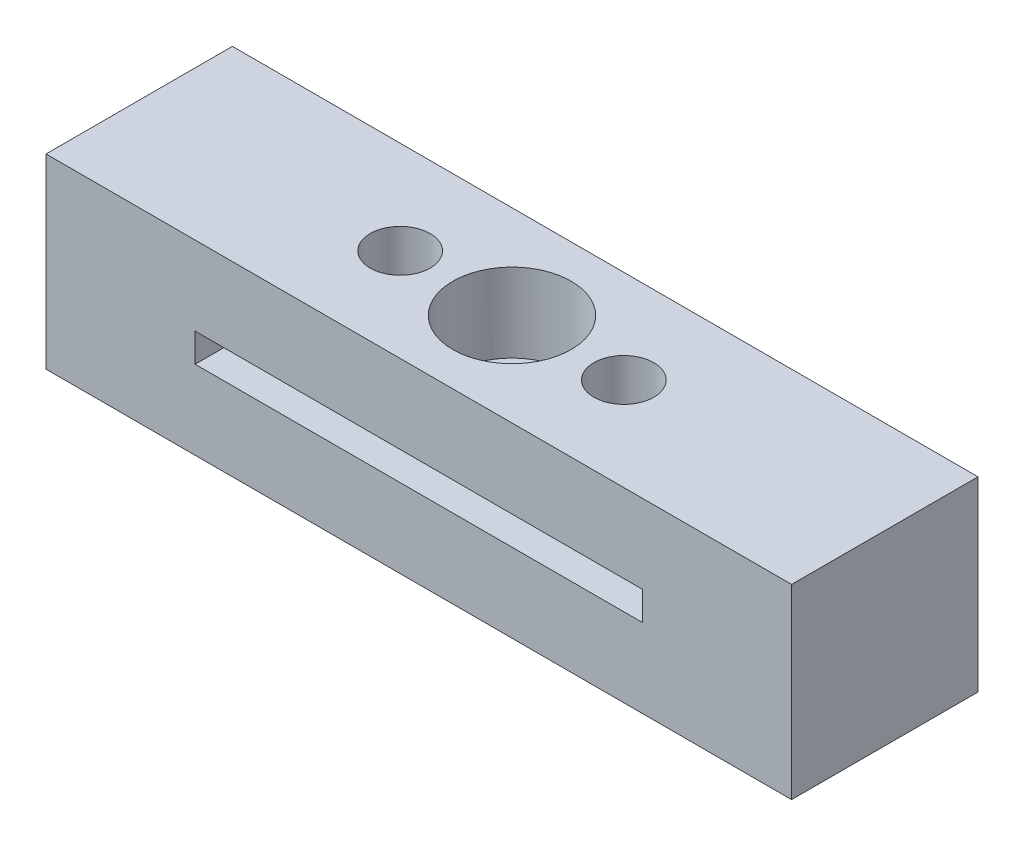
ISO-10303-21;
HEADER;
FILE_DESCRIPTION(('STEP AP214'),'2;1');
FILE_NAME('part.step','',(''),(''),'','','');
FILE_SCHEMA(('AUTOMOTIVE_DESIGN { 1 0 10303 214 1 1 1 1 }'));
ENDSEC;
DATA;
#1=APPLICATION_CONTEXT('core data for automotive mechanical design processes');
#2=APPLICATION_PROTOCOL_DEFINITION('international standard','automotive_design',2000,#1);
#3=PRODUCT_CONTEXT('',#1,'mechanical');
#4=PRODUCT('Part','Part','',(#3));
#5=PRODUCT_RELATED_PRODUCT_CATEGORY('part','',(#4));
#6=PRODUCT_DEFINITION_FORMATION('','',#4);
#7=PRODUCT_DEFINITION_CONTEXT('part definition',#1,'design');
#8=PRODUCT_DEFINITION('design','',#6,#7);
#9=PRODUCT_DEFINITION_SHAPE('','',#8);
#10=(LENGTH_UNIT() NAMED_UNIT(*) SI_UNIT(.MILLI.,.METRE.));
#11=(NAMED_UNIT(*) PLANE_ANGLE_UNIT() SI_UNIT($,.RADIAN.));
#12=(NAMED_UNIT(*) SI_UNIT($,.STERADIAN.) SOLID_ANGLE_UNIT());
#13=UNCERTAINTY_MEASURE_WITH_UNIT(LENGTH_MEASURE(1.E-05),#10,'distance_accuracy_value','');
#14=(GEOMETRIC_REPRESENTATION_CONTEXT(3) GLOBAL_UNCERTAINTY_ASSIGNED_CONTEXT((#13)) GLOBAL_UNIT_ASSIGNED_CONTEXT((#10,
#11,#12)) REPRESENTATION_CONTEXT('',''));
#15=CARTESIAN_POINT('',(0.,0.,0.));
#16=DIRECTION('',(0.,0.,1.));
#17=DIRECTION('',(1.,0.,0.));
#18=AXIS2_PLACEMENT_3D('',#15,#16,#17);
#19=CARTESIAN_POINT('',(31.75,7.9375,7.9375));
#20=DIRECTION('',(0.,-1.,0.));
#21=DIRECTION('',(1.,0.,0.));
#22=AXIS2_PLACEMENT_3D('',#19,#20,#21);
#23=PLANE('',#22);
#24=CARTESIAN_POINT('',(0.,7.9375,0.));
#25=DIRECTION('',(0.,1.,0.));
#26=DIRECTION('',(0.,0.,1.));
#27=AXIS2_PLACEMENT_3D('',#24,#25,#26);
#28=CIRCLE('',#27,5.0419);
#29=CARTESIAN_POINT('',(0.,7.9375,5.0419));
#30=VERTEX_POINT('',#29);
#31=EDGE_CURVE('E291',#30,#30,#28,.T.);
#32=ORIENTED_EDGE('',*,*,#31,.F.);
#33=EDGE_LOOP('',(#32));
#34=FACE_BOUND('',#33,.T.);
#35=CARTESIAN_POINT('',(9.525,7.9375,0.));
#36=DIRECTION('',(0.,1.,0.));
#37=DIRECTION('',(0.,0.,1.));
#38=AXIS2_PLACEMENT_3D('',#35,#36,#37);
#39=CIRCLE('',#38,2.5527);
#40=CARTESIAN_POINT('',(9.525,7.9375,2.5527));
#41=VERTEX_POINT('',#40);
#42=EDGE_CURVE('E189',#41,#41,#39,.T.);
#43=ORIENTED_EDGE('',*,*,#42,.F.);
#44=EDGE_LOOP('',(#43));
#45=FACE_BOUND('',#44,.T.);
#46=DIRECTION('',(-1.,0.,0.));
#47=VECTOR('',#46,1.);
#48=CARTESIAN_POINT('',(31.75,7.9375,-7.9375));
#49=LINE('',#48,#47);
#50=CARTESIAN_POINT('',(31.75,7.9375,-7.9375));
#51=VERTEX_POINT('',#50);
#52=CARTESIAN_POINT('',(-31.75,7.93749999999999,-7.9375));
#53=VERTEX_POINT('',#52);
#54=EDGE_CURVE('E155',#51,#53,#49,.T.);
#55=ORIENTED_EDGE('',*,*,#54,.T.);
#56=DIRECTION('',(0.,0.,-1.));
#57=VECTOR('',#56,1.);
#58=CARTESIAN_POINT('',(-31.75,7.93749999999999,7.9375));
#59=LINE('',#58,#57);
#60=CARTESIAN_POINT('',(-31.75,7.93749999999999,7.9375));
#61=VERTEX_POINT('',#60);
#62=EDGE_CURVE('E161',#61,#53,#59,.T.);
#63=ORIENTED_EDGE('',*,*,#62,.F.);
#64=DIRECTION('',(-1.,0.,0.));
#65=VECTOR('',#64,1.);
#66=CARTESIAN_POINT('',(31.75,7.9375,7.9375));
#67=LINE('',#66,#65);
#68=CARTESIAN_POINT('',(31.75,7.9375,7.9375));
#69=VERTEX_POINT('',#68);
#70=EDGE_CURVE('E159',#69,#61,#67,.T.);
#71=ORIENTED_EDGE('',*,*,#70,.F.);
#72=DIRECTION('',(0.,0.,-1.));
#73=VECTOR('',#72,1.);
#74=CARTESIAN_POINT('',(31.75,7.9375,7.9375));
#75=LINE('',#74,#73);
#76=EDGE_CURVE('E171',#69,#51,#75,.T.);
#77=ORIENTED_EDGE('',*,*,#76,.T.);
#78=EDGE_LOOP('',(#55,#63,#71,#77));
#79=FACE_BOUND('',#78,.T.);
#80=CARTESIAN_POINT('',(-9.525,7.9375,0.));
#81=DIRECTION('',(0.,1.,0.));
#82=DIRECTION('',(0.,0.,1.));
#83=AXIS2_PLACEMENT_3D('',#80,#81,#82);
#84=CIRCLE('',#83,2.5527);
#85=CARTESIAN_POINT('',(-9.525,7.9375,2.5527));
#86=VERTEX_POINT('',#85);
#87=EDGE_CURVE('E186',#86,#86,#84,.T.);
#88=ORIENTED_EDGE('',*,*,#87,.F.);
#89=EDGE_LOOP('',(#88));
#90=FACE_BOUND('',#89,.T.);
#91=ADVANCED_FACE('F45',(#34,#45,#79,#90),#23,.F.);
#92=CARTESIAN_POINT('',(0.,0.,7.9375));
#93=DIRECTION('',(0.,0.,1.));
#94=DIRECTION('',(1.,0.,0.));
#95=AXIS2_PLACEMENT_3D('',#92,#93,#94);
#96=PLANE('',#95);
#97=DIRECTION('',(0.,-1.,0.));
#98=VECTOR('',#97,1.);
#99=CARTESIAN_POINT('',(-31.75,-7.93750000000001,7.9375));
#100=LINE('',#99,#98);
#101=CARTESIAN_POINT('',(-31.75,-7.93750000000001,7.9375));
#102=VERTEX_POINT('',#101);
#103=EDGE_CURVE('E151',#61,#102,#100,.T.);
#104=ORIENTED_EDGE('',*,*,#103,.T.);
#105=DIRECTION('',(1.,0.,0.));
#106=VECTOR('',#105,1.);
#107=CARTESIAN_POINT('',(31.75,-7.9375,7.9375));
#108=LINE('',#107,#106);
#109=CARTESIAN_POINT('',(31.75,-7.9375,7.9375));
#110=VERTEX_POINT('',#109);
#111=EDGE_CURVE('E154',#102,#110,#108,.T.);
#112=ORIENTED_EDGE('',*,*,#111,.T.);
#113=DIRECTION('',(0.,1.,0.));
#114=VECTOR('',#113,1.);
#115=CARTESIAN_POINT('',(31.75,-7.9375,7.9375));
#116=LINE('',#115,#114);
#117=EDGE_CURVE('E157',#110,#69,#116,.T.);
#118=ORIENTED_EDGE('',*,*,#117,.T.);
#119=ORIENTED_EDGE('',*,*,#70,.T.);
#120=EDGE_LOOP('',(#104,#112,#118,#119));
#121=FACE_BOUND('',#120,.T.);
#122=DIRECTION('',(1.,0.,0.));
#123=VECTOR('',#122,1.);
#124=CARTESIAN_POINT('',(19.05,-1.22316653641578,7.9375));
#125=LINE('',#124,#123);
#126=CARTESIAN_POINT('',(-19.05,-1.22316653641578,7.9375));
#127=VERTEX_POINT('',#126);
#128=CARTESIAN_POINT('',(19.05,-1.22316653641578,7.9375));
#129=VERTEX_POINT('',#128);
#130=EDGE_CURVE('E120',#127,#129,#125,.T.);
#131=ORIENTED_EDGE('',*,*,#130,.F.);
#132=DIRECTION('',(0.,-1.,0.));
#133=VECTOR('',#132,1.);
#134=CARTESIAN_POINT('',(-19.05,-1.22316653641578,7.9375));
#135=LINE('',#134,#133);
#136=CARTESIAN_POINT('',(-19.05,1.22316653641578,7.9375));
#137=VERTEX_POINT('',#136);
#138=EDGE_CURVE('E112',#137,#127,#135,.T.);
#139=ORIENTED_EDGE('',*,*,#138,.F.);
#140=DIRECTION('',(-1.,0.,0.));
#141=VECTOR('',#140,1.);
#142=CARTESIAN_POINT('',(19.05,1.22316653641578,7.9375));
#143=LINE('',#142,#141);
#144=CARTESIAN_POINT('',(19.05,1.22316653641578,7.9375));
#145=VERTEX_POINT('',#144);
#146=EDGE_CURVE('E135',#145,#137,#143,.T.);
#147=ORIENTED_EDGE('',*,*,#146,.F.);
#148=DIRECTION('',(0.,1.,0.));
#149=VECTOR('',#148,1.);
#150=CARTESIAN_POINT('',(19.05,-1.22316653641578,7.9375));
#151=LINE('',#150,#149);
#152=EDGE_CURVE('E133',#129,#145,#151,.T.);
#153=ORIENTED_EDGE('',*,*,#152,.F.);
#154=EDGE_LOOP('',(#131,#139,#147,#153));
#155=FACE_BOUND('',#154,.T.);
#156=ADVANCED_FACE('F132',(#121,#155),#96,.T.);
#157=CARTESIAN_POINT('',(0.,0.,-7.9375));
#158=DIRECTION('',(0.,0.,1.));
#159=DIRECTION('',(1.,0.,0.));
#160=AXIS2_PLACEMENT_3D('',#157,#158,#159);
#161=PLANE('',#160);
#162=DIRECTION('',(0.,-1.,0.));
#163=VECTOR('',#162,1.);
#164=CARTESIAN_POINT('',(-31.75,-7.93750000000001,-7.9375));
#165=LINE('',#164,#163);
#166=CARTESIAN_POINT('',(-31.75,-7.93750000000001,-7.9375));
#167=VERTEX_POINT('',#166);
#168=EDGE_CURVE('E128',#53,#167,#165,.T.);
#169=ORIENTED_EDGE('',*,*,#168,.F.);
#170=ORIENTED_EDGE('',*,*,#54,.F.);
#171=DIRECTION('',(0.,1.,0.));
#172=VECTOR('',#171,1.);
#173=CARTESIAN_POINT('',(31.75,-7.9375,-7.9375));
#174=LINE('',#173,#172);
#175=CARTESIAN_POINT('',(31.75,-7.9375,-7.9375));
#176=VERTEX_POINT('',#175);
#177=EDGE_CURVE('E166',#176,#51,#174,.T.);
#178=ORIENTED_EDGE('',*,*,#177,.F.);
#179=DIRECTION('',(1.,0.,0.));
#180=VECTOR('',#179,1.);
#181=CARTESIAN_POINT('',(31.75,-7.9375,-7.9375));
#182=LINE('',#181,#180);
#183=EDGE_CURVE('E164',#167,#176,#182,.T.);
#184=ORIENTED_EDGE('',*,*,#183,.F.);
#185=EDGE_LOOP('',(#169,#170,#178,#184));
#186=FACE_BOUND('',#185,.T.);
#187=DIRECTION('',(0.,-1.,0.));
#188=VECTOR('',#187,1.);
#189=CARTESIAN_POINT('',(-19.05,-1.22316653641578,-7.9375));
#190=LINE('',#189,#188);
#191=CARTESIAN_POINT('',(-19.05,1.22316653641578,-7.9375));
#192=VERTEX_POINT('',#191);
#193=CARTESIAN_POINT('',(-19.05,-1.22316653641578,-7.9375));
#194=VERTEX_POINT('',#193);
#195=EDGE_CURVE('E70',#192,#194,#190,.T.);
#196=ORIENTED_EDGE('',*,*,#195,.T.);
#197=DIRECTION('',(1.,0.,0.));
#198=VECTOR('',#197,1.);
#199=CARTESIAN_POINT('',(19.05,-1.22316653641578,-7.9375));
#200=LINE('',#199,#198);
#201=CARTESIAN_POINT('',(19.05,-1.22316653641578,-7.9375));
#202=VERTEX_POINT('',#201);
#203=EDGE_CURVE('E127',#194,#202,#200,.T.);
#204=ORIENTED_EDGE('',*,*,#203,.T.);
#205=DIRECTION('',(0.,1.,0.));
#206=VECTOR('',#205,1.);
#207=CARTESIAN_POINT('',(19.05,-1.22316653641578,-7.9375));
#208=LINE('',#207,#206);
#209=CARTESIAN_POINT('',(19.05,1.22316653641578,-7.9375));
#210=VERTEX_POINT('',#209);
#211=EDGE_CURVE('E143',#202,#210,#208,.T.);
#212=ORIENTED_EDGE('',*,*,#211,.T.);
#213=DIRECTION('',(-1.,0.,0.));
#214=VECTOR('',#213,1.);
#215=CARTESIAN_POINT('',(19.05,1.22316653641578,-7.9375));
#216=LINE('',#215,#214);
#217=EDGE_CURVE('E121',#210,#192,#216,.T.);
#218=ORIENTED_EDGE('',*,*,#217,.T.);
#219=EDGE_LOOP('',(#196,#204,#212,#218));
#220=FACE_BOUND('',#219,.T.);
#221=ADVANCED_FACE('F214',(#186,#220),#161,.F.);
#222=CARTESIAN_POINT('',(-31.75,-7.93750000000001,7.9375));
#223=DIRECTION('',(1.,0.,0.));
#224=DIRECTION('',(0.,0.,-1.));
#225=AXIS2_PLACEMENT_3D('',#222,#223,#224);
#226=PLANE('',#225);
#227=ORIENTED_EDGE('',*,*,#168,.T.);
#228=DIRECTION('',(0.,0.,-1.));
#229=VECTOR('',#228,1.);
#230=CARTESIAN_POINT('',(-31.75,-7.93750000000001,7.9375));
#231=LINE('',#230,#229);
#232=EDGE_CURVE('E11',#102,#167,#231,.T.);
#233=ORIENTED_EDGE('',*,*,#232,.F.);
#234=ORIENTED_EDGE('',*,*,#103,.F.);
#235=ORIENTED_EDGE('',*,*,#62,.T.);
#236=EDGE_LOOP('',(#227,#233,#234,#235));
#237=FACE_BOUND('',#236,.T.);
#238=ADVANCED_FACE('F47',(#237),#226,.F.);
#239=CARTESIAN_POINT('',(31.75,-7.9375,7.9375));
#240=DIRECTION('',(0.,1.,0.));
#241=DIRECTION('',(-1.,0.,0.));
#242=AXIS2_PLACEMENT_3D('',#239,#240,#241);
#243=PLANE('',#242);
#244=CARTESIAN_POINT('',(0.,-7.93750000000001,0.));
#245=DIRECTION('',(0.,1.,0.));
#246=DIRECTION('',(0.,0.,1.));
#247=AXIS2_PLACEMENT_3D('',#244,#245,#246);
#248=CIRCLE('',#247,5.0419);
#249=CARTESIAN_POINT('',(0.,-7.93750000000001,5.0419));
#250=VERTEX_POINT('',#249);
#251=EDGE_CURVE('E247',#250,#250,#248,.T.);
#252=ORIENTED_EDGE('',*,*,#251,.T.);
#253=EDGE_LOOP('',(#252));
#254=FACE_BOUND('',#253,.T.);
#255=CARTESIAN_POINT('',(9.525,-7.9375,0.));
#256=DIRECTION('',(0.,1.,0.));
#257=DIRECTION('',(0.,0.,1.));
#258=AXIS2_PLACEMENT_3D('',#255,#256,#257);
#259=CIRCLE('',#258,2.5527);
#260=CARTESIAN_POINT('',(9.525,-7.9375,2.5527));
#261=VERTEX_POINT('',#260);
#262=EDGE_CURVE('E182',#261,#261,#259,.T.);
#263=ORIENTED_EDGE('',*,*,#262,.T.);
#264=EDGE_LOOP('',(#263));
#265=FACE_BOUND('',#264,.T.);
#266=CARTESIAN_POINT('',(-9.525,-7.93750000000001,0.));
#267=DIRECTION('',(0.,1.,0.));
#268=DIRECTION('',(0.,0.,1.));
#269=AXIS2_PLACEMENT_3D('',#266,#267,#268);
#270=CIRCLE('',#269,2.5527);
#271=CARTESIAN_POINT('',(-9.525,-7.93750000000001,2.5527));
#272=VERTEX_POINT('',#271);
#273=EDGE_CURVE('E178',#272,#272,#270,.T.);
#274=ORIENTED_EDGE('',*,*,#273,.T.);
#275=EDGE_LOOP('',(#274));
#276=FACE_BOUND('',#275,.T.);
#277=ORIENTED_EDGE('',*,*,#183,.T.);
#278=DIRECTION('',(0.,0.,-1.));
#279=VECTOR('',#278,1.);
#280=CARTESIAN_POINT('',(31.75,-7.9375,7.9375));
#281=LINE('',#280,#279);
#282=EDGE_CURVE('E54',#110,#176,#281,.T.);
#283=ORIENTED_EDGE('',*,*,#282,.F.);
#284=ORIENTED_EDGE('',*,*,#111,.F.);
#285=ORIENTED_EDGE('',*,*,#232,.T.);
#286=EDGE_LOOP('',(#277,#283,#284,#285));
#287=FACE_BOUND('',#286,.T.);
#288=ADVANCED_FACE('F237',(#254,#265,#276,#287),#243,.F.);
#289=CARTESIAN_POINT('',(31.75,-7.9375,7.9375));
#290=DIRECTION('',(-1.,0.,0.));
#291=DIRECTION('',(0.,0.,1.));
#292=AXIS2_PLACEMENT_3D('',#289,#290,#291);
#293=PLANE('',#292);
#294=ORIENTED_EDGE('',*,*,#177,.T.);
#295=ORIENTED_EDGE('',*,*,#76,.F.);
#296=ORIENTED_EDGE('',*,*,#117,.F.);
#297=ORIENTED_EDGE('',*,*,#282,.T.);
#298=EDGE_LOOP('',(#294,#295,#296,#297));
#299=FACE_BOUND('',#298,.T.);
#300=ADVANCED_FACE('F235',(#299),#293,.F.);
#301=CARTESIAN_POINT('',(-19.05,-1.22316653641578,7.9375));
#302=DIRECTION('',(1.,0.,0.));
#303=DIRECTION('',(0.,0.,-1.));
#304=AXIS2_PLACEMENT_3D('',#301,#302,#303);
#305=PLANE('',#304);
#306=ORIENTED_EDGE('',*,*,#195,.F.);
#307=DIRECTION('',(0.,0.,-1.));
#308=VECTOR('',#307,1.);
#309=CARTESIAN_POINT('',(-19.05,1.22316653641578,7.9375));
#310=LINE('',#309,#308);
#311=EDGE_CURVE('E116',#137,#192,#310,.T.);
#312=ORIENTED_EDGE('',*,*,#311,.F.);
#313=ORIENTED_EDGE('',*,*,#138,.T.);
#314=DIRECTION('',(0.,0.,-1.));
#315=VECTOR('',#314,1.);
#316=CARTESIAN_POINT('',(-19.05,-1.22316653641578,7.9375));
#317=LINE('',#316,#315);
#318=EDGE_CURVE('E115',#127,#194,#317,.T.);
#319=ORIENTED_EDGE('',*,*,#318,.T.);
#320=EDGE_LOOP('',(#306,#312,#313,#319));
#321=FACE_BOUND('',#320,.T.);
#322=ADVANCED_FACE('F114',(#321),#305,.T.);
#323=CARTESIAN_POINT('',(19.05,-1.22316653641578,7.9375));
#324=DIRECTION('',(0.,1.,0.));
#325=DIRECTION('',(0.,0.,1.));
#326=AXIS2_PLACEMENT_3D('',#323,#324,#325);
#327=PLANE('',#326);
#328=CARTESIAN_POINT('',(0.,-1.22316653641578,0.));
#329=DIRECTION('',(0.,1.,0.));
#330=DIRECTION('',(0.,0.,1.));
#331=AXIS2_PLACEMENT_3D('',#328,#329,#330);
#332=CIRCLE('',#331,5.0419);
#333=CARTESIAN_POINT('',(0.,-1.22316653641578,5.0419));
#334=VERTEX_POINT('',#333);
#335=EDGE_CURVE('E194',#334,#334,#332,.T.);
#336=ORIENTED_EDGE('',*,*,#335,.F.);
#337=EDGE_LOOP('',(#336));
#338=FACE_BOUND('',#337,.T.);
#339=CARTESIAN_POINT('',(9.525,-1.22316653641578,0.));
#340=DIRECTION('',(0.,1.,0.));
#341=DIRECTION('',(0.,0.,1.));
#342=AXIS2_PLACEMENT_3D('',#339,#340,#341);
#343=CIRCLE('',#342,2.5527);
#344=CARTESIAN_POINT('',(9.525,-1.22316653641578,2.5527));
#345=VERTEX_POINT('',#344);
#346=EDGE_CURVE('E181',#345,#345,#343,.T.);
#347=ORIENTED_EDGE('',*,*,#346,.F.);
#348=EDGE_LOOP('',(#347));
#349=FACE_BOUND('',#348,.T.);
#350=CARTESIAN_POINT('',(-9.525,-1.22316653641578,0.));
#351=DIRECTION('',(0.,1.,0.));
#352=DIRECTION('',(0.,0.,1.));
#353=AXIS2_PLACEMENT_3D('',#350,#351,#352);
#354=CIRCLE('',#353,2.5527);
#355=CARTESIAN_POINT('',(-9.525,-1.22316653641578,2.5527));
#356=VERTEX_POINT('',#355);
#357=EDGE_CURVE('E176',#356,#356,#354,.T.);
#358=ORIENTED_EDGE('',*,*,#357,.F.);
#359=EDGE_LOOP('',(#358));
#360=FACE_BOUND('',#359,.T.);
#361=ORIENTED_EDGE('',*,*,#203,.F.);
#362=ORIENTED_EDGE('',*,*,#318,.F.);
#363=ORIENTED_EDGE('',*,*,#130,.T.);
#364=DIRECTION('',(0.,0.,-1.));
#365=VECTOR('',#364,1.);
#366=CARTESIAN_POINT('',(19.05,-1.22316653641578,7.9375));
#367=LINE('',#366,#365);
#368=EDGE_CURVE('E129',#129,#202,#367,.T.);
#369=ORIENTED_EDGE('',*,*,#368,.T.);
#370=EDGE_LOOP('',(#361,#362,#363,#369));
#371=FACE_BOUND('',#370,.T.);
#372=ADVANCED_FACE('F124',(#338,#349,#360,#371),#327,.T.);
#373=CARTESIAN_POINT('',(19.05,-1.22316653641578,7.9375));
#374=DIRECTION('',(-1.,0.,0.));
#375=DIRECTION('',(0.,0.,1.));
#376=AXIS2_PLACEMENT_3D('',#373,#374,#375);
#377=PLANE('',#376);
#378=ORIENTED_EDGE('',*,*,#211,.F.);
#379=ORIENTED_EDGE('',*,*,#368,.F.);
#380=ORIENTED_EDGE('',*,*,#152,.T.);
#381=DIRECTION('',(0.,0.,-1.));
#382=VECTOR('',#381,1.);
#383=CARTESIAN_POINT('',(19.05,1.22316653641578,7.9375));
#384=LINE('',#383,#382);
#385=EDGE_CURVE('E62',#145,#210,#384,.T.);
#386=ORIENTED_EDGE('',*,*,#385,.T.);
#387=EDGE_LOOP('',(#378,#379,#380,#386));
#388=FACE_BOUND('',#387,.T.);
#389=ADVANCED_FACE('F209',(#388),#377,.T.);
#390=CARTESIAN_POINT('',(19.05,1.22316653641578,7.9375));
#391=DIRECTION('',(0.,-1.,0.));
#392=DIRECTION('',(1.,0.,0.));
#393=AXIS2_PLACEMENT_3D('',#390,#391,#392);
#394=PLANE('',#393);
#395=CARTESIAN_POINT('',(0.,1.22316653641578,0.));
#396=DIRECTION('',(0.,-1.,0.));
#397=DIRECTION('',(1.,0.,0.));
#398=AXIS2_PLACEMENT_3D('',#395,#396,#397);
#399=CIRCLE('',#398,5.0419);
#400=CARTESIAN_POINT('',(5.0419,1.22316653641578,0.));
#401=VERTEX_POINT('',#400);
#402=EDGE_CURVE('E49',#401,#401,#399,.T.);
#403=ORIENTED_EDGE('',*,*,#402,.F.);
#404=EDGE_LOOP('',(#403));
#405=FACE_BOUND('',#404,.T.);
#406=CARTESIAN_POINT('',(9.525,1.22316653641578,0.));
#407=DIRECTION('',(0.,-1.,0.));
#408=DIRECTION('',(1.,0.,0.));
#409=AXIS2_PLACEMENT_3D('',#406,#407,#408);
#410=CIRCLE('',#409,2.5527);
#411=CARTESIAN_POINT('',(12.0777,1.22316653641578,0.));
#412=VERTEX_POINT('',#411);
#413=EDGE_CURVE('E179',#412,#412,#410,.T.);
#414=ORIENTED_EDGE('',*,*,#413,.F.);
#415=EDGE_LOOP('',(#414));
#416=FACE_BOUND('',#415,.T.);
#417=CARTESIAN_POINT('',(-9.525,1.22316653641578,0.));
#418=DIRECTION('',(0.,-1.,0.));
#419=DIRECTION('',(1.,0.,0.));
#420=AXIS2_PLACEMENT_3D('',#417,#418,#419);
#421=CIRCLE('',#420,2.5527);
#422=CARTESIAN_POINT('',(-6.9723,1.22316653641578,0.));
#423=VERTEX_POINT('',#422);
#424=EDGE_CURVE('E141',#423,#423,#421,.T.);
#425=ORIENTED_EDGE('',*,*,#424,.F.);
#426=EDGE_LOOP('',(#425));
#427=FACE_BOUND('',#426,.T.);
#428=ORIENTED_EDGE('',*,*,#217,.F.);
#429=ORIENTED_EDGE('',*,*,#385,.F.);
#430=ORIENTED_EDGE('',*,*,#146,.T.);
#431=ORIENTED_EDGE('',*,*,#311,.T.);
#432=EDGE_LOOP('',(#428,#429,#430,#431));
#433=FACE_BOUND('',#432,.T.);
#434=ADVANCED_FACE('F207',(#405,#416,#427,#433),#394,.T.);
#435=CARTESIAN_POINT('',(-9.525,7.9375,0.));
#436=DIRECTION('',(0.,1.,0.));
#437=DIRECTION('',(0.,0.,1.));
#438=AXIS2_PLACEMENT_3D('',#435,#436,#437);
#439=CYLINDRICAL_SURFACE('',#438,2.5527);
#440=ORIENTED_EDGE('',*,*,#424,.T.);
#441=EDGE_LOOP('',(#440));
#442=FACE_BOUND('',#441,.T.);
#443=ORIENTED_EDGE('',*,*,#87,.T.);
#444=EDGE_LOOP('',(#443));
#445=FACE_BOUND('',#444,.T.);
#446=ADVANCED_FACE('F204',(#442,#445),#439,.F.);
#447=ORIENTED_EDGE('',*,*,#357,.T.);
#448=EDGE_LOOP('',(#447));
#449=FACE_BOUND('',#448,.T.);
#450=ORIENTED_EDGE('',*,*,#273,.F.);
#451=EDGE_LOOP('',(#450));
#452=FACE_BOUND('',#451,.T.);
#453=ADVANCED_FACE('F266',(#449,#452),#439,.F.);
#454=CARTESIAN_POINT('',(9.525,7.9375,0.));
#455=DIRECTION('',(0.,1.,0.));
#456=DIRECTION('',(0.,0.,1.));
#457=AXIS2_PLACEMENT_3D('',#454,#455,#456);
#458=CYLINDRICAL_SURFACE('',#457,2.5527);
#459=ORIENTED_EDGE('',*,*,#413,.T.);
#460=EDGE_LOOP('',(#459));
#461=FACE_BOUND('',#460,.T.);
#462=ORIENTED_EDGE('',*,*,#42,.T.);
#463=EDGE_LOOP('',(#462));
#464=FACE_BOUND('',#463,.T.);
#465=ADVANCED_FACE('F271',(#461,#464),#458,.F.);
#466=ORIENTED_EDGE('',*,*,#346,.T.);
#467=EDGE_LOOP('',(#466));
#468=FACE_BOUND('',#467,.T.);
#469=ORIENTED_EDGE('',*,*,#262,.F.);
#470=EDGE_LOOP('',(#469));
#471=FACE_BOUND('',#470,.T.);
#472=ADVANCED_FACE('F276',(#468,#471),#458,.F.);
#473=CARTESIAN_POINT('',(0.,7.9375,0.));
#474=DIRECTION('',(0.,1.,0.));
#475=DIRECTION('',(0.,0.,1.));
#476=AXIS2_PLACEMENT_3D('',#473,#474,#475);
#477=CYLINDRICAL_SURFACE('',#476,5.0419);
#478=ORIENTED_EDGE('',*,*,#402,.T.);
#479=EDGE_LOOP('',(#478));
#480=FACE_BOUND('',#479,.T.);
#481=ORIENTED_EDGE('',*,*,#31,.T.);
#482=EDGE_LOOP('',(#481));
#483=FACE_BOUND('',#482,.T.);
#484=ADVANCED_FACE('F277',(#480,#483),#477,.F.);
#485=ORIENTED_EDGE('',*,*,#335,.T.);
#486=EDGE_LOOP('',(#485));
#487=FACE_BOUND('',#486,.T.);
#488=ORIENTED_EDGE('',*,*,#251,.F.);
#489=EDGE_LOOP('',(#488));
#490=FACE_BOUND('',#489,.T.);
#491=ADVANCED_FACE('F279',(#487,#490),#477,.F.);
#492=CLOSED_SHELL('',(#91,#156,#221,#238,#288,#300,#322,#372,#389,#434,#446,#453,#465,#472,#484,#491));
#493=MANIFOLD_SOLID_BREP('B2',#492);
#494=ADVANCED_BREP_SHAPE_REPRESENTATION('',(#18,#493),#14);
#495=SHAPE_DEFINITION_REPRESENTATION(#9,#494);
ENDSEC;
END-ISO-10303-21;
